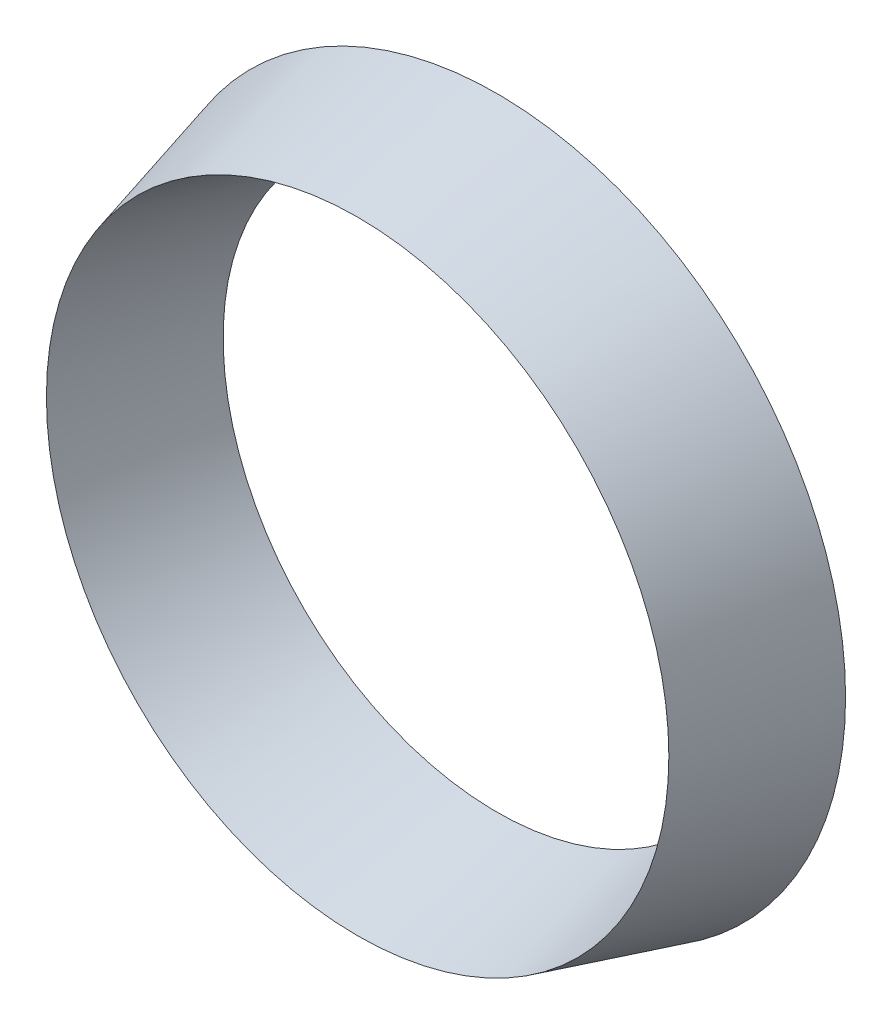
ISO-10303-21;
HEADER;
FILE_DESCRIPTION(('STEP AP214'),'2;1');
FILE_NAME('part.step','',(''),(''),'','','');
FILE_SCHEMA(('AUTOMOTIVE_DESIGN { 1 0 10303 214 1 1 1 1 }'));
ENDSEC;
DATA;
#1=APPLICATION_CONTEXT('core data for automotive mechanical design processes');
#2=APPLICATION_PROTOCOL_DEFINITION('international standard','automotive_design',2000,#1);
#3=PRODUCT_CONTEXT('',#1,'mechanical');
#4=PRODUCT('Part','Part','',(#3));
#5=PRODUCT_RELATED_PRODUCT_CATEGORY('part','',(#4));
#6=PRODUCT_DEFINITION_FORMATION('','',#4);
#7=PRODUCT_DEFINITION_CONTEXT('part definition',#1,'design');
#8=PRODUCT_DEFINITION('design','',#6,#7);
#9=PRODUCT_DEFINITION_SHAPE('','',#8);
#10=(LENGTH_UNIT() NAMED_UNIT(*) SI_UNIT(.MILLI.,.METRE.));
#11=(NAMED_UNIT(*) PLANE_ANGLE_UNIT() SI_UNIT($,.RADIAN.));
#12=(NAMED_UNIT(*) SI_UNIT($,.STERADIAN.) SOLID_ANGLE_UNIT());
#13=UNCERTAINTY_MEASURE_WITH_UNIT(LENGTH_MEASURE(1.E-05),#10,'distance_accuracy_value','');
#14=(GEOMETRIC_REPRESENTATION_CONTEXT(3) GLOBAL_UNCERTAINTY_ASSIGNED_CONTEXT((#13)) GLOBAL_UNIT_ASSIGNED_CONTEXT((#10,
#11,#12)) REPRESENTATION_CONTEXT('',''));
#15=CARTESIAN_POINT('',(0.,0.,0.));
#16=DIRECTION('',(0.,0.,1.));
#17=DIRECTION('',(1.,0.,0.));
#18=AXIS2_PLACEMENT_3D('',#15,#16,#17);
#19=CARTESIAN_POINT('',(0.,0.,0.));
#20=DIRECTION('',(0.,0.,1.));
#21=DIRECTION('',(1.,0.,0.));
#22=AXIS2_PLACEMENT_3D('',#19,#20,#21);
#23=CONICAL_SURFACE('',#22,22.,0.261799387799149);
#24=CARTESIAN_POINT('',(0.,0.,0.));
#25=DIRECTION('',(0.,0.,1.));
#26=DIRECTION('',(1.,0.,0.));
#27=AXIS2_PLACEMENT_3D('',#24,#25,#26);
#28=CIRCLE('',#27,22.);
#29=CARTESIAN_POINT('',(22.,0.,0.));
#30=VERTEX_POINT('',#29);
#31=EDGE_CURVE('E45',#30,#30,#28,.T.);
#32=ORIENTED_EDGE('',*,*,#31,.F.);
#33=EDGE_LOOP('',(#32));
#34=FACE_BOUND('',#33,.T.);
#35=CARTESIAN_POINT('',(0.,0.,11.1961524227066));
#36=DIRECTION('',(0.,0.,1.));
#37=DIRECTION('',(1.,0.,0.));
#38=AXIS2_PLACEMENT_3D('',#35,#36,#37);
#39=CIRCLE('',#38,25.);
#40=CARTESIAN_POINT('',(25.,0.,11.1961524227066));
#41=VERTEX_POINT('',#40);
#42=EDGE_CURVE('E10',#41,#41,#39,.T.);
#43=ORIENTED_EDGE('',*,*,#42,.T.);
#44=EDGE_LOOP('',(#43));
#45=FACE_BOUND('',#44,.T.);
#46=ADVANCED_FACE('F35',(#34,#45),#23,.F.);
#47=CARTESIAN_POINT('',(0.,0.,0.));
#48=DIRECTION('',(0.,0.,1.));
#49=DIRECTION('',(1.,0.,0.));
#50=AXIS2_PLACEMENT_3D('',#47,#48,#49);
#51=PLANE('',#50);
#52=CARTESIAN_POINT('',(0.,0.,0.));
#53=DIRECTION('',(0.,0.,1.));
#54=DIRECTION('',(1.,0.,0.));
#55=AXIS2_PLACEMENT_3D('',#52,#53,#54);
#56=CIRCLE('',#55,28.);
#57=CARTESIAN_POINT('',(28.,0.,0.));
#58=VERTEX_POINT('',#57);
#59=EDGE_CURVE('E41',#58,#58,#56,.T.);
#60=ORIENTED_EDGE('',*,*,#59,.F.);
#61=EDGE_LOOP('',(#60));
#62=FACE_BOUND('',#61,.T.);
#63=ORIENTED_EDGE('',*,*,#31,.T.);
#64=EDGE_LOOP('',(#63));
#65=FACE_BOUND('',#64,.T.);
#66=ADVANCED_FACE('F52',(#62,#65),#51,.F.);
#67=CARTESIAN_POINT('',(0.,0.,0.));
#68=DIRECTION('',(0.,0.,-1.));
#69=DIRECTION('',(1.,0.,0.));
#70=AXIS2_PLACEMENT_3D('',#67,#68,#69);
#71=CONICAL_SURFACE('',#70,28.,0.261799387799149);
#72=ORIENTED_EDGE('',*,*,#42,.F.);
#73=EDGE_LOOP('',(#72));
#74=FACE_BOUND('',#73,.T.);
#75=ORIENTED_EDGE('',*,*,#59,.T.);
#76=EDGE_LOOP('',(#75));
#77=FACE_BOUND('',#76,.T.);
#78=ADVANCED_FACE('F58',(#74,#77),#71,.T.);
#79=CLOSED_SHELL('',(#46,#66,#78));
#80=MANIFOLD_SOLID_BREP('B2',#79);
#81=ADVANCED_BREP_SHAPE_REPRESENTATION('',(#18,#80),#14);
#82=SHAPE_DEFINITION_REPRESENTATION(#9,#81);
ENDSEC;
END-ISO-10303-21;
